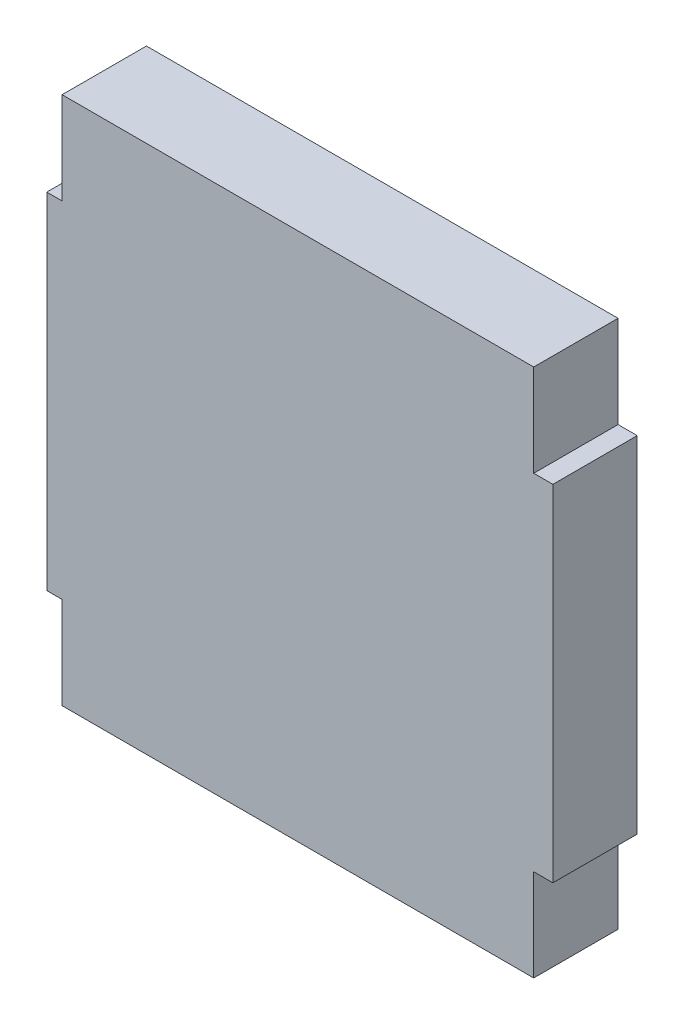
ISO-10303-21;
HEADER;
FILE_DESCRIPTION(('STEP AP214'),'2;1');
FILE_NAME('part.step','',(''),(''),'','','');
FILE_SCHEMA(('AUTOMOTIVE_DESIGN { 1 0 10303 214 1 1 1 1 }'));
ENDSEC;
DATA;
#1=APPLICATION_CONTEXT('core data for automotive mechanical design processes');
#2=APPLICATION_PROTOCOL_DEFINITION('international standard','automotive_design',2000,#1);
#3=PRODUCT_CONTEXT('',#1,'mechanical');
#4=PRODUCT('Part','Part','',(#3));
#5=PRODUCT_RELATED_PRODUCT_CATEGORY('part','',(#4));
#6=PRODUCT_DEFINITION_FORMATION('','',#4);
#7=PRODUCT_DEFINITION_CONTEXT('part definition',#1,'design');
#8=PRODUCT_DEFINITION('design','',#6,#7);
#9=PRODUCT_DEFINITION_SHAPE('','',#8);
#10=(LENGTH_UNIT() NAMED_UNIT(*) SI_UNIT(.MILLI.,.METRE.));
#11=(NAMED_UNIT(*) PLANE_ANGLE_UNIT() SI_UNIT($,.RADIAN.));
#12=(NAMED_UNIT(*) SI_UNIT($,.STERADIAN.) SOLID_ANGLE_UNIT());
#13=UNCERTAINTY_MEASURE_WITH_UNIT(LENGTH_MEASURE(1.E-05),#10,'distance_accuracy_value','');
#14=(GEOMETRIC_REPRESENTATION_CONTEXT(3) GLOBAL_UNCERTAINTY_ASSIGNED_CONTEXT((#13)) GLOBAL_UNIT_ASSIGNED_CONTEXT((#10,
#11,#12)) REPRESENTATION_CONTEXT('',''));
#15=CARTESIAN_POINT('',(0.,0.,0.));
#16=DIRECTION('',(0.,0.,1.));
#17=DIRECTION('',(1.,0.,0.));
#18=AXIS2_PLACEMENT_3D('',#15,#16,#17);
#19=CARTESIAN_POINT('',(-3.275,2.25,1.1));
#20=DIRECTION('',(1.,0.,0.));
#21=DIRECTION('',(0.,0.,-1.));
#22=AXIS2_PLACEMENT_3D('',#19,#20,#21);
#23=PLANE('',#22);
#24=DIRECTION('',(0.,-1.,0.));
#25=VECTOR('',#24,1.);
#26=CARTESIAN_POINT('',(-3.275,2.25,0.));
#27=LINE('',#26,#25);
#28=CARTESIAN_POINT('',(-3.275,2.25,0.));
#29=VERTEX_POINT('',#28);
#30=CARTESIAN_POINT('',(-3.275,-2.25,0.));
#31=VERTEX_POINT('',#30);
#32=EDGE_CURVE('E155',#29,#31,#27,.T.);
#33=ORIENTED_EDGE('',*,*,#32,.T.);
#34=DIRECTION('',(0.,0.,-1.));
#35=VECTOR('',#34,1.);
#36=CARTESIAN_POINT('',(-3.275,-2.25,1.1));
#37=LINE('',#36,#35);
#38=CARTESIAN_POINT('',(-3.275,-2.25,1.1));
#39=VERTEX_POINT('',#38);
#40=EDGE_CURVE('E11',#39,#31,#37,.T.);
#41=ORIENTED_EDGE('',*,*,#40,.F.);
#42=DIRECTION('',(0.,-1.,0.));
#43=VECTOR('',#42,1.);
#44=CARTESIAN_POINT('',(-3.275,2.25,1.1));
#45=LINE('',#44,#43);
#46=CARTESIAN_POINT('',(-3.275,2.25,1.1));
#47=VERTEX_POINT('',#46);
#48=EDGE_CURVE('E178',#47,#39,#45,.T.);
#49=ORIENTED_EDGE('',*,*,#48,.F.);
#50=DIRECTION('',(0.,0.,-1.));
#51=VECTOR('',#50,1.);
#52=CARTESIAN_POINT('',(-3.275,2.25,1.1));
#53=LINE('',#52,#51);
#54=EDGE_CURVE('E151',#47,#29,#53,.T.);
#55=ORIENTED_EDGE('',*,*,#54,.T.);
#56=EDGE_LOOP('',(#33,#41,#49,#55));
#57=FACE_BOUND('',#56,.T.);
#58=ADVANCED_FACE('F34',(#57),#23,.F.);
#59=CARTESIAN_POINT('',(-3.275,-2.25,1.1));
#60=DIRECTION('',(0.,1.,0.));
#61=DIRECTION('',(0.,0.,1.));
#62=AXIS2_PLACEMENT_3D('',#59,#60,#61);
#63=PLANE('',#62);
#64=DIRECTION('',(1.,0.,0.));
#65=VECTOR('',#64,1.);
#66=CARTESIAN_POINT('',(-3.275,-2.25,0.));
#67=LINE('',#66,#65);
#68=CARTESIAN_POINT('',(-3.075,-2.25,0.));
#69=VERTEX_POINT('',#68);
#70=EDGE_CURVE('E158',#31,#69,#67,.T.);
#71=ORIENTED_EDGE('',*,*,#70,.T.);
#72=DIRECTION('',(0.,0.,-1.));
#73=VECTOR('',#72,1.);
#74=CARTESIAN_POINT('',(-3.075,-2.25,1.1));
#75=LINE('',#74,#73);
#76=CARTESIAN_POINT('',(-3.075,-2.25,1.1));
#77=VERTEX_POINT('',#76);
#78=EDGE_CURVE('E42',#77,#69,#75,.T.);
#79=ORIENTED_EDGE('',*,*,#78,.F.);
#80=DIRECTION('',(1.,0.,0.));
#81=VECTOR('',#80,1.);
#82=CARTESIAN_POINT('',(-3.275,-2.25,1.1));
#83=LINE('',#82,#81);
#84=EDGE_CURVE('E103',#39,#77,#83,.T.);
#85=ORIENTED_EDGE('',*,*,#84,.F.);
#86=ORIENTED_EDGE('',*,*,#40,.T.);
#87=EDGE_LOOP('',(#71,#79,#85,#86));
#88=FACE_BOUND('',#87,.T.);
#89=ADVANCED_FACE('F246',(#88),#63,.F.);
#90=CARTESIAN_POINT('',(-3.075,-2.25,1.1));
#91=DIRECTION('',(1.,0.,0.));
#92=DIRECTION('',(0.,0.,-1.));
#93=AXIS2_PLACEMENT_3D('',#90,#91,#92);
#94=PLANE('',#93);
#95=DIRECTION('',(0.,-1.,0.));
#96=VECTOR('',#95,1.);
#97=CARTESIAN_POINT('',(-3.075,-2.25,0.));
#98=LINE('',#97,#96);
#99=CARTESIAN_POINT('',(-3.075,-3.45,0.));
#100=VERTEX_POINT('',#99);
#101=EDGE_CURVE('E160',#69,#100,#98,.T.);
#102=ORIENTED_EDGE('',*,*,#101,.T.);
#103=DIRECTION('',(0.,0.,-1.));
#104=VECTOR('',#103,1.);
#105=CARTESIAN_POINT('',(-3.075,-3.45,1.1));
#106=LINE('',#105,#104);
#107=CARTESIAN_POINT('',(-3.075,-3.45,1.1));
#108=VERTEX_POINT('',#107);
#109=EDGE_CURVE('E197',#108,#100,#106,.T.);
#110=ORIENTED_EDGE('',*,*,#109,.F.);
#111=DIRECTION('',(0.,-1.,0.));
#112=VECTOR('',#111,1.);
#113=CARTESIAN_POINT('',(-3.075,-2.25,1.1));
#114=LINE('',#113,#112);
#115=EDGE_CURVE('E205',#77,#108,#114,.T.);
#116=ORIENTED_EDGE('',*,*,#115,.F.);
#117=ORIENTED_EDGE('',*,*,#78,.T.);
#118=EDGE_LOOP('',(#102,#110,#116,#117));
#119=FACE_BOUND('',#118,.T.);
#120=ADVANCED_FACE('F203',(#119),#94,.F.);
#121=CARTESIAN_POINT('',(-3.075,-3.45,1.1));
#122=DIRECTION('',(0.,1.,0.));
#123=DIRECTION('',(0.,0.,1.));
#124=AXIS2_PLACEMENT_3D('',#121,#122,#123);
#125=PLANE('',#124);
#126=DIRECTION('',(1.,0.,0.));
#127=VECTOR('',#126,1.);
#128=CARTESIAN_POINT('',(-3.075,-3.45,0.));
#129=LINE('',#128,#127);
#130=CARTESIAN_POINT('',(3.075,-3.45,0.));
#131=VERTEX_POINT('',#130);
#132=EDGE_CURVE('E162',#100,#131,#129,.T.);
#133=ORIENTED_EDGE('',*,*,#132,.T.);
#134=DIRECTION('',(0.,0.,-1.));
#135=VECTOR('',#134,1.);
#136=CARTESIAN_POINT('',(3.075,-3.45,1.1));
#137=LINE('',#136,#135);
#138=CARTESIAN_POINT('',(3.075,-3.45,1.1));
#139=VERTEX_POINT('',#138);
#140=EDGE_CURVE('E194',#139,#131,#137,.T.);
#141=ORIENTED_EDGE('',*,*,#140,.F.);
#142=DIRECTION('',(1.,0.,0.));
#143=VECTOR('',#142,1.);
#144=CARTESIAN_POINT('',(-3.075,-3.45,1.1));
#145=LINE('',#144,#143);
#146=EDGE_CURVE('E221',#108,#139,#145,.T.);
#147=ORIENTED_EDGE('',*,*,#146,.F.);
#148=ORIENTED_EDGE('',*,*,#109,.T.);
#149=EDGE_LOOP('',(#133,#141,#147,#148));
#150=FACE_BOUND('',#149,.T.);
#151=ADVANCED_FACE('F212',(#150),#125,.F.);
#152=CARTESIAN_POINT('',(3.075,-3.45,1.1));
#153=DIRECTION('',(-1.,0.,0.));
#154=DIRECTION('',(0.,0.,1.));
#155=AXIS2_PLACEMENT_3D('',#152,#153,#154);
#156=PLANE('',#155);
#157=DIRECTION('',(0.,1.,0.));
#158=VECTOR('',#157,1.);
#159=CARTESIAN_POINT('',(3.075,-3.45,0.));
#160=LINE('',#159,#158);
#161=CARTESIAN_POINT('',(3.075,-2.25,0.));
#162=VERTEX_POINT('',#161);
#163=EDGE_CURVE('E164',#131,#162,#160,.T.);
#164=ORIENTED_EDGE('',*,*,#163,.T.);
#165=DIRECTION('',(0.,0.,-1.));
#166=VECTOR('',#165,1.);
#167=CARTESIAN_POINT('',(3.075,-2.25,1.1));
#168=LINE('',#167,#166);
#169=CARTESIAN_POINT('',(3.075,-2.25,1.1));
#170=VERTEX_POINT('',#169);
#171=EDGE_CURVE('E191',#170,#162,#168,.T.);
#172=ORIENTED_EDGE('',*,*,#171,.F.);
#173=DIRECTION('',(0.,1.,0.));
#174=VECTOR('',#173,1.);
#175=CARTESIAN_POINT('',(3.075,-3.45,1.1));
#176=LINE('',#175,#174);
#177=EDGE_CURVE('E218',#139,#170,#176,.T.);
#178=ORIENTED_EDGE('',*,*,#177,.F.);
#179=ORIENTED_EDGE('',*,*,#140,.T.);
#180=EDGE_LOOP('',(#164,#172,#178,#179));
#181=FACE_BOUND('',#180,.T.);
#182=ADVANCED_FACE('F216',(#181),#156,.F.);
#183=CARTESIAN_POINT('',(3.075,-2.25,1.1));
#184=DIRECTION('',(0.,1.,0.));
#185=DIRECTION('',(0.,0.,1.));
#186=AXIS2_PLACEMENT_3D('',#183,#184,#185);
#187=PLANE('',#186);
#188=DIRECTION('',(1.,0.,0.));
#189=VECTOR('',#188,1.);
#190=CARTESIAN_POINT('',(3.075,-2.25,0.));
#191=LINE('',#190,#189);
#192=CARTESIAN_POINT('',(3.325,-2.25,0.));
#193=VERTEX_POINT('',#192);
#194=EDGE_CURVE('E166',#162,#193,#191,.T.);
#195=ORIENTED_EDGE('',*,*,#194,.T.);
#196=DIRECTION('',(0.,0.,-1.));
#197=VECTOR('',#196,1.);
#198=CARTESIAN_POINT('',(3.325,-2.25,1.1));
#199=LINE('',#198,#197);
#200=CARTESIAN_POINT('',(3.325,-2.25,1.1));
#201=VERTEX_POINT('',#200);
#202=EDGE_CURVE('E188',#201,#193,#199,.T.);
#203=ORIENTED_EDGE('',*,*,#202,.F.);
#204=DIRECTION('',(1.,0.,0.));
#205=VECTOR('',#204,1.);
#206=CARTESIAN_POINT('',(3.075,-2.25,1.1));
#207=LINE('',#206,#205);
#208=EDGE_CURVE('E220',#170,#201,#207,.T.);
#209=ORIENTED_EDGE('',*,*,#208,.F.);
#210=ORIENTED_EDGE('',*,*,#171,.T.);
#211=EDGE_LOOP('',(#195,#203,#209,#210));
#212=FACE_BOUND('',#211,.T.);
#213=ADVANCED_FACE('F258',(#212),#187,.F.);
#214=CARTESIAN_POINT('',(3.325,-2.25,1.1));
#215=DIRECTION('',(-1.,0.,0.));
#216=DIRECTION('',(0.,0.,1.));
#217=AXIS2_PLACEMENT_3D('',#214,#215,#216);
#218=PLANE('',#217);
#219=DIRECTION('',(0.,1.,0.));
#220=VECTOR('',#219,1.);
#221=CARTESIAN_POINT('',(3.325,-2.25,0.));
#222=LINE('',#221,#220);
#223=CARTESIAN_POINT('',(3.325,2.25,0.));
#224=VERTEX_POINT('',#223);
#225=EDGE_CURVE('E168',#193,#224,#222,.T.);
#226=ORIENTED_EDGE('',*,*,#225,.T.);
#227=DIRECTION('',(0.,0.,-1.));
#228=VECTOR('',#227,1.);
#229=CARTESIAN_POINT('',(3.325,2.25,1.1));
#230=LINE('',#229,#228);
#231=CARTESIAN_POINT('',(3.325,2.25,1.1));
#232=VERTEX_POINT('',#231);
#233=EDGE_CURVE('E185',#232,#224,#230,.T.);
#234=ORIENTED_EDGE('',*,*,#233,.F.);
#235=DIRECTION('',(0.,1.,0.));
#236=VECTOR('',#235,1.);
#237=CARTESIAN_POINT('',(3.325,-2.25,1.1));
#238=LINE('',#237,#236);
#239=EDGE_CURVE('E223',#201,#232,#238,.T.);
#240=ORIENTED_EDGE('',*,*,#239,.F.);
#241=ORIENTED_EDGE('',*,*,#202,.T.);
#242=EDGE_LOOP('',(#226,#234,#240,#241));
#243=FACE_BOUND('',#242,.T.);
#244=ADVANCED_FACE('F261',(#243),#218,.F.);
#245=CARTESIAN_POINT('',(3.325,2.25,1.1));
#246=DIRECTION('',(0.,-1.,0.));
#247=DIRECTION('',(0.,0.,-1.));
#248=AXIS2_PLACEMENT_3D('',#245,#246,#247);
#249=PLANE('',#248);
#250=DIRECTION('',(-1.,0.,0.));
#251=VECTOR('',#250,1.);
#252=CARTESIAN_POINT('',(3.325,2.25,0.));
#253=LINE('',#252,#251);
#254=CARTESIAN_POINT('',(3.075,2.25,0.));
#255=VERTEX_POINT('',#254);
#256=EDGE_CURVE('E170',#224,#255,#253,.T.);
#257=ORIENTED_EDGE('',*,*,#256,.T.);
#258=DIRECTION('',(0.,0.,-1.));
#259=VECTOR('',#258,1.);
#260=CARTESIAN_POINT('',(3.075,2.25,1.1));
#261=LINE('',#260,#259);
#262=CARTESIAN_POINT('',(3.075,2.25,1.1));
#263=VERTEX_POINT('',#262);
#264=EDGE_CURVE('E182',#263,#255,#261,.T.);
#265=ORIENTED_EDGE('',*,*,#264,.F.);
#266=DIRECTION('',(-1.,0.,0.));
#267=VECTOR('',#266,1.);
#268=CARTESIAN_POINT('',(3.325,2.25,1.1));
#269=LINE('',#268,#267);
#270=EDGE_CURVE('E229',#232,#263,#269,.T.);
#271=ORIENTED_EDGE('',*,*,#270,.F.);
#272=ORIENTED_EDGE('',*,*,#233,.T.);
#273=EDGE_LOOP('',(#257,#265,#271,#272));
#274=FACE_BOUND('',#273,.T.);
#275=ADVANCED_FACE('F235',(#274),#249,.F.);
#276=CARTESIAN_POINT('',(3.075,2.25,1.1));
#277=DIRECTION('',(-1.,0.,0.));
#278=DIRECTION('',(0.,0.,1.));
#279=AXIS2_PLACEMENT_3D('',#276,#277,#278);
#280=PLANE('',#279);
#281=DIRECTION('',(0.,1.,0.));
#282=VECTOR('',#281,1.);
#283=CARTESIAN_POINT('',(3.075,2.25,0.));
#284=LINE('',#283,#282);
#285=CARTESIAN_POINT('',(3.075,3.45,0.));
#286=VERTEX_POINT('',#285);
#287=EDGE_CURVE('E172',#255,#286,#284,.T.);
#288=ORIENTED_EDGE('',*,*,#287,.T.);
#289=DIRECTION('',(0.,0.,-1.));
#290=VECTOR('',#289,1.);
#291=CARTESIAN_POINT('',(3.075,3.45,1.1));
#292=LINE('',#291,#290);
#293=CARTESIAN_POINT('',(3.075,3.45,1.1));
#294=VERTEX_POINT('',#293);
#295=EDGE_CURVE('E146',#294,#286,#292,.T.);
#296=ORIENTED_EDGE('',*,*,#295,.F.);
#297=DIRECTION('',(0.,1.,0.));
#298=VECTOR('',#297,1.);
#299=CARTESIAN_POINT('',(3.075,2.25,1.1));
#300=LINE('',#299,#298);
#301=EDGE_CURVE('E135',#263,#294,#300,.T.);
#302=ORIENTED_EDGE('',*,*,#301,.F.);
#303=ORIENTED_EDGE('',*,*,#264,.T.);
#304=EDGE_LOOP('',(#288,#296,#302,#303));
#305=FACE_BOUND('',#304,.T.);
#306=ADVANCED_FACE('F239',(#305),#280,.F.);
#307=CARTESIAN_POINT('',(3.075,3.45,1.1));
#308=DIRECTION('',(0.,-1.,0.));
#309=DIRECTION('',(0.,0.,-1.));
#310=AXIS2_PLACEMENT_3D('',#307,#308,#309);
#311=PLANE('',#310);
#312=DIRECTION('',(-1.,0.,0.));
#313=VECTOR('',#312,1.);
#314=CARTESIAN_POINT('',(3.075,3.45,0.));
#315=LINE('',#314,#313);
#316=CARTESIAN_POINT('',(-3.075,3.45,0.));
#317=VERTEX_POINT('',#316);
#318=EDGE_CURVE('E144',#286,#317,#315,.T.);
#319=ORIENTED_EDGE('',*,*,#318,.T.);
#320=DIRECTION('',(0.,0.,-1.));
#321=VECTOR('',#320,1.);
#322=CARTESIAN_POINT('',(-3.075,3.45,1.1));
#323=LINE('',#322,#321);
#324=CARTESIAN_POINT('',(-3.075,3.45,1.1));
#325=VERTEX_POINT('',#324);
#326=EDGE_CURVE('E141',#325,#317,#323,.T.);
#327=ORIENTED_EDGE('',*,*,#326,.F.);
#328=DIRECTION('',(-1.,0.,0.));
#329=VECTOR('',#328,1.);
#330=CARTESIAN_POINT('',(3.075,3.45,1.1));
#331=LINE('',#330,#329);
#332=EDGE_CURVE('E128',#294,#325,#331,.T.);
#333=ORIENTED_EDGE('',*,*,#332,.F.);
#334=ORIENTED_EDGE('',*,*,#295,.T.);
#335=EDGE_LOOP('',(#319,#327,#333,#334));
#336=FACE_BOUND('',#335,.T.);
#337=ADVANCED_FACE('F142',(#336),#311,.F.);
#338=CARTESIAN_POINT('',(-3.075,3.45,1.1));
#339=DIRECTION('',(1.,0.,0.));
#340=DIRECTION('',(0.,0.,-1.));
#341=AXIS2_PLACEMENT_3D('',#338,#339,#340);
#342=PLANE('',#341);
#343=DIRECTION('',(0.,-1.,0.));
#344=VECTOR('',#343,1.);
#345=CARTESIAN_POINT('',(-3.075,3.45,0.));
#346=LINE('',#345,#344);
#347=CARTESIAN_POINT('',(-3.075,2.25,0.));
#348=VERTEX_POINT('',#347);
#349=EDGE_CURVE('E175',#317,#348,#346,.T.);
#350=ORIENTED_EDGE('',*,*,#349,.T.);
#351=DIRECTION('',(0.,0.,-1.));
#352=VECTOR('',#351,1.);
#353=CARTESIAN_POINT('',(-3.075,2.25,1.1));
#354=LINE('',#353,#352);
#355=CARTESIAN_POINT('',(-3.075,2.25,1.1));
#356=VERTEX_POINT('',#355);
#357=EDGE_CURVE('E147',#356,#348,#354,.T.);
#358=ORIENTED_EDGE('',*,*,#357,.F.);
#359=DIRECTION('',(0.,-1.,0.));
#360=VECTOR('',#359,1.);
#361=CARTESIAN_POINT('',(-3.075,3.45,1.1));
#362=LINE('',#361,#360);
#363=EDGE_CURVE('E132',#325,#356,#362,.T.);
#364=ORIENTED_EDGE('',*,*,#363,.F.);
#365=ORIENTED_EDGE('',*,*,#326,.T.);
#366=EDGE_LOOP('',(#350,#358,#364,#365));
#367=FACE_BOUND('',#366,.T.);
#368=ADVANCED_FACE('F149',(#367),#342,.F.);
#369=CARTESIAN_POINT('',(-3.2,2.25,1.1));
#370=DIRECTION('',(0.,-1.,0.));
#371=DIRECTION('',(0.,0.,-1.));
#372=AXIS2_PLACEMENT_3D('',#369,#370,#371);
#373=PLANE('',#372);
#374=DIRECTION('',(-1.,0.,0.));
#375=VECTOR('',#374,1.);
#376=CARTESIAN_POINT('',(-3.2,2.25,0.));
#377=LINE('',#376,#375);
#378=EDGE_CURVE('E91',#348,#29,#377,.T.);
#379=ORIENTED_EDGE('',*,*,#378,.T.);
#380=ORIENTED_EDGE('',*,*,#54,.F.);
#381=DIRECTION('',(-1.,0.,0.));
#382=VECTOR('',#381,1.);
#383=CARTESIAN_POINT('',(-3.075,2.25,1.1));
#384=LINE('',#383,#382);
#385=EDGE_CURVE('E50',#356,#47,#384,.T.);
#386=ORIENTED_EDGE('',*,*,#385,.F.);
#387=ORIENTED_EDGE('',*,*,#357,.T.);
#388=EDGE_LOOP('',(#379,#380,#386,#387));
#389=FACE_BOUND('',#388,.T.);
#390=ADVANCED_FACE('F240',(#389),#373,.F.);
#391=CARTESIAN_POINT('',(0.,0.,1.1));
#392=DIRECTION('',(0.,0.,1.));
#393=DIRECTION('',(1.,0.,0.));
#394=AXIS2_PLACEMENT_3D('',#391,#392,#393);
#395=PLANE('',#394);
#396=ORIENTED_EDGE('',*,*,#48,.T.);
#397=ORIENTED_EDGE('',*,*,#84,.T.);
#398=ORIENTED_EDGE('',*,*,#115,.T.);
#399=ORIENTED_EDGE('',*,*,#146,.T.);
#400=ORIENTED_EDGE('',*,*,#177,.T.);
#401=ORIENTED_EDGE('',*,*,#208,.T.);
#402=ORIENTED_EDGE('',*,*,#239,.T.);
#403=ORIENTED_EDGE('',*,*,#270,.T.);
#404=ORIENTED_EDGE('',*,*,#301,.T.);
#405=ORIENTED_EDGE('',*,*,#332,.T.);
#406=ORIENTED_EDGE('',*,*,#363,.T.);
#407=ORIENTED_EDGE('',*,*,#385,.T.);
#408=EDGE_LOOP('',(#396,#397,#398,#399,#400,#401,#402,#403,#404,#405,#406,#407));
#409=FACE_BOUND('',#408,.T.);
#410=ADVANCED_FACE('F130',(#409),#395,.T.);
#411=CARTESIAN_POINT('',(0.,0.,0.));
#412=DIRECTION('',(0.,0.,1.));
#413=DIRECTION('',(1.,0.,0.));
#414=AXIS2_PLACEMENT_3D('',#411,#412,#413);
#415=PLANE('',#414);
#416=ORIENTED_EDGE('',*,*,#32,.F.);
#417=ORIENTED_EDGE('',*,*,#378,.F.);
#418=ORIENTED_EDGE('',*,*,#349,.F.);
#419=ORIENTED_EDGE('',*,*,#318,.F.);
#420=ORIENTED_EDGE('',*,*,#287,.F.);
#421=ORIENTED_EDGE('',*,*,#256,.F.);
#422=ORIENTED_EDGE('',*,*,#225,.F.);
#423=ORIENTED_EDGE('',*,*,#194,.F.);
#424=ORIENTED_EDGE('',*,*,#163,.F.);
#425=ORIENTED_EDGE('',*,*,#132,.F.);
#426=ORIENTED_EDGE('',*,*,#101,.F.);
#427=ORIENTED_EDGE('',*,*,#70,.F.);
#428=EDGE_LOOP('',(#416,#417,#418,#419,#420,#421,#422,#423,#424,#425,#426,#427));
#429=FACE_BOUND('',#428,.T.);
#430=ADVANCED_FACE('F207',(#429),#415,.F.);
#431=CLOSED_SHELL('',(#58,#89,#120,#151,#182,#213,#244,#275,#306,#337,#368,#390,#410,#430));
#432=MANIFOLD_SOLID_BREP('B2',#431);
#433=ADVANCED_BREP_SHAPE_REPRESENTATION('',(#18,#432),#14);
#434=SHAPE_DEFINITION_REPRESENTATION(#9,#433);
ENDSEC;
END-ISO-10303-21;
